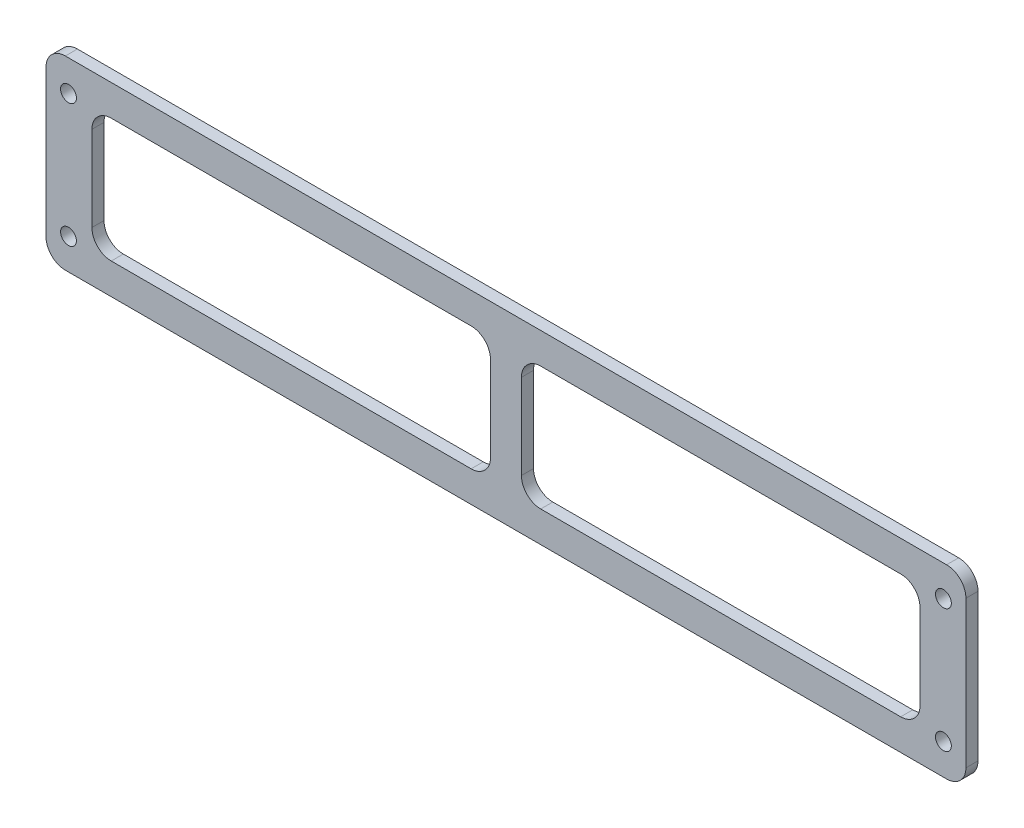
ISO-10303-21;
HEADER;
FILE_DESCRIPTION(('STEP AP214'),'2;1');
FILE_NAME('part.step','',(''),(''),'','','');
FILE_SCHEMA(('AUTOMOTIVE_DESIGN { 1 0 10303 214 1 1 1 1 }'));
ENDSEC;
DATA;
#1=APPLICATION_CONTEXT('core data for automotive mechanical design processes');
#2=APPLICATION_PROTOCOL_DEFINITION('international standard','automotive_design',2000,#1);
#3=PRODUCT_CONTEXT('',#1,'mechanical');
#4=PRODUCT('Part','Part','',(#3));
#5=PRODUCT_RELATED_PRODUCT_CATEGORY('part','',(#4));
#6=PRODUCT_DEFINITION_FORMATION('','',#4);
#7=PRODUCT_DEFINITION_CONTEXT('part definition',#1,'design');
#8=PRODUCT_DEFINITION('design','',#6,#7);
#9=PRODUCT_DEFINITION_SHAPE('','',#8);
#10=(LENGTH_UNIT() NAMED_UNIT(*) SI_UNIT(.MILLI.,.METRE.));
#11=(NAMED_UNIT(*) PLANE_ANGLE_UNIT() SI_UNIT($,.RADIAN.));
#12=(NAMED_UNIT(*) SI_UNIT($,.STERADIAN.) SOLID_ANGLE_UNIT());
#13=UNCERTAINTY_MEASURE_WITH_UNIT(LENGTH_MEASURE(1.E-05),#10,'distance_accuracy_value','');
#14=(GEOMETRIC_REPRESENTATION_CONTEXT(3) GLOBAL_UNCERTAINTY_ASSIGNED_CONTEXT((#13)) GLOBAL_UNIT_ASSIGNED_CONTEXT((#10,
#11,#12)) REPRESENTATION_CONTEXT('',''));
#15=CARTESIAN_POINT('',(0.,0.,0.));
#16=DIRECTION('',(0.,0.,1.));
#17=DIRECTION('',(1.,0.,0.));
#18=AXIS2_PLACEMENT_3D('',#15,#16,#17);
#19=CARTESIAN_POINT('',(0.,0.,3.125));
#20=DIRECTION('',(0.,0.,1.));
#21=DIRECTION('',(1.,0.,0.));
#22=AXIS2_PLACEMENT_3D('',#19,#20,#21);
#23=PLANE('',#22);
#24=CARTESIAN_POINT('',(113.175,16.,3.125));
#25=DIRECTION('',(0.,0.,1.));
#26=DIRECTION('',(1.,0.,0.));
#27=AXIS2_PLACEMENT_3D('',#24,#25,#26);
#28=CIRCLE('',#27,2.04999999999999);
#29=CARTESIAN_POINT('',(115.225,16.,3.125));
#30=VERTEX_POINT('',#29);
#31=EDGE_CURVE('E389',#30,#30,#28,.T.);
#32=ORIENTED_EDGE('',*,*,#31,.F.);
#33=EDGE_LOOP('',(#32));
#34=FACE_BOUND('',#33,.T.);
#35=CARTESIAN_POINT('',(-113.175,16.,3.125));
#36=DIRECTION('',(0.,0.,1.));
#37=DIRECTION('',(1.,0.,0.));
#38=AXIS2_PLACEMENT_3D('',#35,#36,#37);
#39=CIRCLE('',#38,2.04999999999999);
#40=CARTESIAN_POINT('',(-111.125,16.,3.125));
#41=VERTEX_POINT('',#40);
#42=EDGE_CURVE('E401',#41,#41,#39,.T.);
#43=ORIENTED_EDGE('',*,*,#42,.F.);
#44=EDGE_LOOP('',(#43));
#45=FACE_BOUND('',#44,.T.);
#46=DIRECTION('',(0.,1.,0.));
#47=VECTOR('',#46,1.);
#48=CARTESIAN_POINT('',(119.,-24.,3.125));
#49=LINE('',#48,#47);
#50=CARTESIAN_POINT('',(119.,-19.,3.125));
#51=VERTEX_POINT('',#50);
#52=CARTESIAN_POINT('',(119.,19.,3.125));
#53=VERTEX_POINT('',#52);
#54=EDGE_CURVE('E227',#51,#53,#49,.T.);
#55=ORIENTED_EDGE('',*,*,#54,.T.);
#56=CARTESIAN_POINT('',(114.,19.,3.125));
#57=DIRECTION('',(0.,0.,1.));
#58=DIRECTION('',(1.,0.,0.));
#59=AXIS2_PLACEMENT_3D('',#56,#57,#58);
#60=CIRCLE('',#59,5.);
#61=CARTESIAN_POINT('',(114.,24.,3.125));
#62=VERTEX_POINT('',#61);
#63=EDGE_CURVE('E289',#53,#62,#60,.T.);
#64=ORIENTED_EDGE('',*,*,#63,.T.);
#65=DIRECTION('',(-1.,0.,0.));
#66=VECTOR('',#65,1.);
#67=CARTESIAN_POINT('',(119.,24.,3.125));
#68=LINE('',#67,#66);
#69=CARTESIAN_POINT('',(-114.,24.,3.125));
#70=VERTEX_POINT('',#69);
#71=EDGE_CURVE('E222',#62,#70,#68,.T.);
#72=ORIENTED_EDGE('',*,*,#71,.T.);
#73=CARTESIAN_POINT('',(-114.,19.,3.125));
#74=DIRECTION('',(0.,0.,1.));
#75=DIRECTION('',(1.,0.,0.));
#76=AXIS2_PLACEMENT_3D('',#73,#74,#75);
#77=CIRCLE('',#76,5.);
#78=CARTESIAN_POINT('',(-119.,19.,3.125));
#79=VERTEX_POINT('',#78);
#80=EDGE_CURVE('E284',#70,#79,#77,.T.);
#81=ORIENTED_EDGE('',*,*,#80,.T.);
#82=DIRECTION('',(0.,-1.,0.));
#83=VECTOR('',#82,1.);
#84=CARTESIAN_POINT('',(-119.,-24.,3.125));
#85=LINE('',#84,#83);
#86=CARTESIAN_POINT('',(-119.,-19.,3.125));
#87=VERTEX_POINT('',#86);
#88=EDGE_CURVE('E407',#79,#87,#85,.T.);
#89=ORIENTED_EDGE('',*,*,#88,.T.);
#90=CARTESIAN_POINT('',(-114.,-19.,3.125));
#91=DIRECTION('',(0.,0.,1.));
#92=DIRECTION('',(1.,0.,0.));
#93=AXIS2_PLACEMENT_3D('',#90,#91,#92);
#94=CIRCLE('',#93,5.);
#95=CARTESIAN_POINT('',(-114.,-24.,3.125));
#96=VERTEX_POINT('',#95);
#97=EDGE_CURVE('E55',#87,#96,#94,.T.);
#98=ORIENTED_EDGE('',*,*,#97,.T.);
#99=DIRECTION('',(1.,0.,0.));
#100=VECTOR('',#99,1.);
#101=CARTESIAN_POINT('',(119.,-24.,3.125));
#102=LINE('',#101,#100);
#103=CARTESIAN_POINT('',(114.,-24.,3.125));
#104=VERTEX_POINT('',#103);
#105=EDGE_CURVE('E409',#96,#104,#102,.T.);
#106=ORIENTED_EDGE('',*,*,#105,.T.);
#107=CARTESIAN_POINT('',(114.,-19.,3.125));
#108=DIRECTION('',(0.,0.,1.));
#109=DIRECTION('',(1.,0.,0.));
#110=AXIS2_PLACEMENT_3D('',#107,#108,#109);
#111=CIRCLE('',#110,5.);
#112=EDGE_CURVE('E287',#104,#51,#111,.T.);
#113=ORIENTED_EDGE('',*,*,#112,.T.);
#114=EDGE_LOOP('',(#55,#64,#72,#81,#89,#98,#106,#113));
#115=FACE_BOUND('',#114,.T.);
#116=CARTESIAN_POINT('',(-113.175,-16.,3.125));
#117=DIRECTION('',(0.,0.,1.));
#118=DIRECTION('',(1.,0.,0.));
#119=AXIS2_PLACEMENT_3D('',#116,#117,#118);
#120=CIRCLE('',#119,2.04999999999999);
#121=CARTESIAN_POINT('',(-111.125,-16.,3.125));
#122=VERTEX_POINT('',#121);
#123=EDGE_CURVE('E395',#122,#122,#120,.T.);
#124=ORIENTED_EDGE('',*,*,#123,.F.);
#125=EDGE_LOOP('',(#124));
#126=FACE_BOUND('',#125,.T.);
#127=CARTESIAN_POINT('',(113.175,-16.,3.125));
#128=DIRECTION('',(0.,0.,1.));
#129=DIRECTION('',(1.,0.,0.));
#130=AXIS2_PLACEMENT_3D('',#127,#128,#129);
#131=CIRCLE('',#130,2.04999999999999);
#132=CARTESIAN_POINT('',(115.225,-16.,3.125));
#133=VERTEX_POINT('',#132);
#134=EDGE_CURVE('E383',#133,#133,#131,.T.);
#135=ORIENTED_EDGE('',*,*,#134,.F.);
#136=EDGE_LOOP('',(#135));
#137=FACE_BOUND('',#136,.T.);
#138=DIRECTION('',(1.,0.,0.));
#139=VECTOR('',#138,1.);
#140=CARTESIAN_POINT('',(-107.125,-16.,3.125));
#141=LINE('',#140,#139);
#142=CARTESIAN_POINT('',(-102.125,-16.,3.125));
#143=VERTEX_POINT('',#142);
#144=CARTESIAN_POINT('',(-9.00000000000001,-16.,3.125));
#145=VERTEX_POINT('',#144);
#146=EDGE_CURVE('E367',#143,#145,#141,.T.);
#147=ORIENTED_EDGE('',*,*,#146,.F.);
#148=CARTESIAN_POINT('',(-102.125,-11.,3.125));
#149=DIRECTION('',(0.,0.,1.));
#150=DIRECTION('',(1.,0.,0.));
#151=AXIS2_PLACEMENT_3D('',#148,#149,#150);
#152=CIRCLE('',#151,5.);
#153=CARTESIAN_POINT('',(-107.125,-11.,3.125));
#154=VERTEX_POINT('',#153);
#155=EDGE_CURVE('E207',#143,#154,#152,.F.);
#156=ORIENTED_EDGE('',*,*,#155,.T.);
#157=DIRECTION('',(0.,-1.,0.));
#158=VECTOR('',#157,1.);
#159=CARTESIAN_POINT('',(-107.125,16.,3.125));
#160=LINE('',#159,#158);
#161=CARTESIAN_POINT('',(-107.125,11.,3.125));
#162=VERTEX_POINT('',#161);
#163=EDGE_CURVE('E365',#162,#154,#160,.T.);
#164=ORIENTED_EDGE('',*,*,#163,.F.);
#165=CARTESIAN_POINT('',(-102.125,11.,3.125));
#166=DIRECTION('',(0.,0.,1.));
#167=DIRECTION('',(1.,0.,0.));
#168=AXIS2_PLACEMENT_3D('',#165,#166,#167);
#169=CIRCLE('',#168,5.);
#170=CARTESIAN_POINT('',(-102.125,16.,3.125));
#171=VERTEX_POINT('',#170);
#172=EDGE_CURVE('E206',#162,#171,#169,.F.);
#173=ORIENTED_EDGE('',*,*,#172,.T.);
#174=DIRECTION('',(-1.,0.,0.));
#175=VECTOR('',#174,1.);
#176=CARTESIAN_POINT('',(-107.125,16.,3.125));
#177=LINE('',#176,#175);
#178=CARTESIAN_POINT('',(-9.00000000000001,16.,3.125));
#179=VERTEX_POINT('',#178);
#180=EDGE_CURVE('E373',#179,#171,#177,.T.);
#181=ORIENTED_EDGE('',*,*,#180,.F.);
#182=CARTESIAN_POINT('',(-9.00000000000001,11.,3.125));
#183=DIRECTION('',(0.,0.,1.));
#184=DIRECTION('',(1.,0.,0.));
#185=AXIS2_PLACEMENT_3D('',#182,#183,#184);
#186=CIRCLE('',#185,5.);
#187=CARTESIAN_POINT('',(-4.,11.,3.125));
#188=VERTEX_POINT('',#187);
#189=EDGE_CURVE('E306',#179,#188,#186,.F.);
#190=ORIENTED_EDGE('',*,*,#189,.T.);
#191=DIRECTION('',(0.,1.,0.));
#192=VECTOR('',#191,1.);
#193=CARTESIAN_POINT('',(-4.,16.,3.125));
#194=LINE('',#193,#192);
#195=CARTESIAN_POINT('',(-4.,-11.,3.125));
#196=VERTEX_POINT('',#195);
#197=EDGE_CURVE('E370',#196,#188,#194,.T.);
#198=ORIENTED_EDGE('',*,*,#197,.F.);
#199=CARTESIAN_POINT('',(-9.00000000000001,-11.,3.125));
#200=DIRECTION('',(0.,0.,1.));
#201=DIRECTION('',(1.,0.,0.));
#202=AXIS2_PLACEMENT_3D('',#199,#200,#201);
#203=CIRCLE('',#202,5.);
#204=EDGE_CURVE('E310',#196,#145,#203,.F.);
#205=ORIENTED_EDGE('',*,*,#204,.T.);
#206=EDGE_LOOP('',(#147,#156,#164,#173,#181,#190,#198,#205));
#207=FACE_BOUND('',#206,.T.);
#208=DIRECTION('',(-1.,0.,0.));
#209=VECTOR('',#208,1.);
#210=CARTESIAN_POINT('',(107.125,16.,3.125));
#211=LINE('',#210,#209);
#212=CARTESIAN_POINT('',(102.125,16.,3.125));
#213=VERTEX_POINT('',#212);
#214=CARTESIAN_POINT('',(9.00000000000012,16.,3.125));
#215=VERTEX_POINT('',#214);
#216=EDGE_CURVE('E351',#213,#215,#211,.T.);
#217=ORIENTED_EDGE('',*,*,#216,.F.);
#218=CARTESIAN_POINT('',(102.125,11.,3.125));
#219=DIRECTION('',(0.,0.,1.));
#220=DIRECTION('',(1.,0.,0.));
#221=AXIS2_PLACEMENT_3D('',#218,#219,#220);
#222=CIRCLE('',#221,5.);
#223=CARTESIAN_POINT('',(107.125,11.,3.125));
#224=VERTEX_POINT('',#223);
#225=EDGE_CURVE('E318',#213,#224,#222,.F.);
#226=ORIENTED_EDGE('',*,*,#225,.T.);
#227=DIRECTION('',(0.,1.,0.));
#228=VECTOR('',#227,1.);
#229=CARTESIAN_POINT('',(107.125,16.,3.125));
#230=LINE('',#229,#228);
#231=CARTESIAN_POINT('',(107.125,-11.,3.125));
#232=VERTEX_POINT('',#231);
#233=EDGE_CURVE('E338',#232,#224,#230,.T.);
#234=ORIENTED_EDGE('',*,*,#233,.F.);
#235=CARTESIAN_POINT('',(102.125,-11.,3.125));
#236=DIRECTION('',(0.,0.,1.));
#237=DIRECTION('',(1.,0.,0.));
#238=AXIS2_PLACEMENT_3D('',#235,#236,#237);
#239=CIRCLE('',#238,5.);
#240=CARTESIAN_POINT('',(102.125,-16.,3.125));
#241=VERTEX_POINT('',#240);
#242=EDGE_CURVE('E314',#232,#241,#239,.F.);
#243=ORIENTED_EDGE('',*,*,#242,.T.);
#244=DIRECTION('',(1.,0.,0.));
#245=VECTOR('',#244,1.);
#246=CARTESIAN_POINT('',(107.125,-16.,3.125));
#247=LINE('',#246,#245);
#248=CARTESIAN_POINT('',(9.00000000000012,-16.,3.125));
#249=VERTEX_POINT('',#248);
#250=EDGE_CURVE('E218',#249,#241,#247,.T.);
#251=ORIENTED_EDGE('',*,*,#250,.F.);
#252=CARTESIAN_POINT('',(9.00000000000012,-11.,3.125));
#253=DIRECTION('',(0.,0.,1.));
#254=DIRECTION('',(1.,0.,0.));
#255=AXIS2_PLACEMENT_3D('',#252,#253,#254);
#256=CIRCLE('',#255,5.);
#257=CARTESIAN_POINT('',(4.00000000000011,-11.,3.125));
#258=VERTEX_POINT('',#257);
#259=EDGE_CURVE('E11',#249,#258,#256,.F.);
#260=ORIENTED_EDGE('',*,*,#259,.T.);
#261=DIRECTION('',(0.,-1.,0.));
#262=VECTOR('',#261,1.);
#263=CARTESIAN_POINT('',(4.00000000000011,16.,3.125));
#264=LINE('',#263,#262);
#265=CARTESIAN_POINT('',(4.00000000000011,11.,3.125));
#266=VERTEX_POINT('',#265);
#267=EDGE_CURVE('E346',#266,#258,#264,.T.);
#268=ORIENTED_EDGE('',*,*,#267,.F.);
#269=CARTESIAN_POINT('',(9.00000000000012,11.,3.125));
#270=DIRECTION('',(0.,0.,1.));
#271=DIRECTION('',(1.,0.,0.));
#272=AXIS2_PLACEMENT_3D('',#269,#270,#271);
#273=CIRCLE('',#272,5.);
#274=EDGE_CURVE('E322',#266,#215,#273,.F.);
#275=ORIENTED_EDGE('',*,*,#274,.T.);
#276=EDGE_LOOP('',(#217,#226,#234,#243,#251,#260,#268,#275));
#277=FACE_BOUND('',#276,.T.);
#278=ADVANCED_FACE('F33',(#34,#45,#115,#126,#137,#207,#277),#23,.T.);
#279=CARTESIAN_POINT('',(0.,0.,0.));
#280=DIRECTION('',(0.,0.,1.));
#281=DIRECTION('',(1.,0.,0.));
#282=AXIS2_PLACEMENT_3D('',#279,#280,#281);
#283=PLANE('',#282);
#284=DIRECTION('',(-1.,0.,0.));
#285=VECTOR('',#284,1.);
#286=CARTESIAN_POINT('',(-107.125,16.,0.));
#287=LINE('',#286,#285);
#288=CARTESIAN_POINT('',(-9.00000000000001,16.,0.));
#289=VERTEX_POINT('',#288);
#290=CARTESIAN_POINT('',(-102.125,16.,0.));
#291=VERTEX_POINT('',#290);
#292=EDGE_CURVE('E201',#289,#291,#287,.T.);
#293=ORIENTED_EDGE('',*,*,#292,.T.);
#294=CARTESIAN_POINT('',(-102.125,11.,0.));
#295=DIRECTION('',(0.,0.,1.));
#296=DIRECTION('',(1.,0.,0.));
#297=AXIS2_PLACEMENT_3D('',#294,#295,#296);
#298=CIRCLE('',#297,5.);
#299=CARTESIAN_POINT('',(-107.125,11.,0.));
#300=VERTEX_POINT('',#299);
#301=EDGE_CURVE('E195',#291,#300,#298,.T.);
#302=ORIENTED_EDGE('',*,*,#301,.T.);
#303=DIRECTION('',(0.,-1.,0.));
#304=VECTOR('',#303,1.);
#305=CARTESIAN_POINT('',(-107.125,16.,0.));
#306=LINE('',#305,#304);
#307=CARTESIAN_POINT('',(-107.125,-11.,0.));
#308=VERTEX_POINT('',#307);
#309=EDGE_CURVE('E199',#300,#308,#306,.T.);
#310=ORIENTED_EDGE('',*,*,#309,.T.);
#311=CARTESIAN_POINT('',(-102.125,-11.,0.));
#312=DIRECTION('',(0.,0.,1.));
#313=DIRECTION('',(1.,0.,0.));
#314=AXIS2_PLACEMENT_3D('',#311,#312,#313);
#315=CIRCLE('',#314,5.);
#316=CARTESIAN_POINT('',(-102.125,-16.,0.));
#317=VERTEX_POINT('',#316);
#318=EDGE_CURVE('E300',#308,#317,#315,.T.);
#319=ORIENTED_EDGE('',*,*,#318,.T.);
#320=DIRECTION('',(1.,0.,0.));
#321=VECTOR('',#320,1.);
#322=CARTESIAN_POINT('',(-107.125,-16.,0.));
#323=LINE('',#322,#321);
#324=CARTESIAN_POINT('',(-9.00000000000001,-16.,0.));
#325=VERTEX_POINT('',#324);
#326=EDGE_CURVE('E217',#317,#325,#323,.T.);
#327=ORIENTED_EDGE('',*,*,#326,.T.);
#328=CARTESIAN_POINT('',(-9.00000000000001,-11.,0.));
#329=DIRECTION('',(0.,0.,1.));
#330=DIRECTION('',(1.,0.,0.));
#331=AXIS2_PLACEMENT_3D('',#328,#329,#330);
#332=CIRCLE('',#331,5.);
#333=CARTESIAN_POINT('',(-4.,-11.,0.));
#334=VERTEX_POINT('',#333);
#335=EDGE_CURVE('E308',#325,#334,#332,.T.);
#336=ORIENTED_EDGE('',*,*,#335,.T.);
#337=DIRECTION('',(0.,1.,0.));
#338=VECTOR('',#337,1.);
#339=CARTESIAN_POINT('',(-4.,16.,0.));
#340=LINE('',#339,#338);
#341=CARTESIAN_POINT('',(-4.,11.,0.));
#342=VERTEX_POINT('',#341);
#343=EDGE_CURVE('E379',#334,#342,#340,.T.);
#344=ORIENTED_EDGE('',*,*,#343,.T.);
#345=CARTESIAN_POINT('',(-9.00000000000001,11.,0.));
#346=DIRECTION('',(0.,0.,1.));
#347=DIRECTION('',(1.,0.,0.));
#348=AXIS2_PLACEMENT_3D('',#345,#346,#347);
#349=CIRCLE('',#348,5.);
#350=EDGE_CURVE('E304',#342,#289,#349,.T.);
#351=ORIENTED_EDGE('',*,*,#350,.T.);
#352=EDGE_LOOP('',(#293,#302,#310,#319,#327,#336,#344,#351));
#353=FACE_BOUND('',#352,.T.);
#354=DIRECTION('',(-1.,0.,0.));
#355=VECTOR('',#354,1.);
#356=CARTESIAN_POINT('',(119.,24.,0.));
#357=LINE('',#356,#355);
#358=CARTESIAN_POINT('',(114.,24.,0.));
#359=VERTEX_POINT('',#358);
#360=CARTESIAN_POINT('',(-114.,24.,0.));
#361=VERTEX_POINT('',#360);
#362=EDGE_CURVE('E230',#359,#361,#357,.T.);
#363=ORIENTED_EDGE('',*,*,#362,.F.);
#364=CARTESIAN_POINT('',(114.,19.,0.));
#365=DIRECTION('',(0.,0.,1.));
#366=DIRECTION('',(1.,0.,0.));
#367=AXIS2_PLACEMENT_3D('',#364,#365,#366);
#368=CIRCLE('',#367,5.);
#369=CARTESIAN_POINT('',(119.,19.,0.));
#370=VERTEX_POINT('',#369);
#371=EDGE_CURVE('E277',#359,#370,#368,.F.);
#372=ORIENTED_EDGE('',*,*,#371,.T.);
#373=DIRECTION('',(0.,1.,0.));
#374=VECTOR('',#373,1.);
#375=CARTESIAN_POINT('',(119.,-24.,0.));
#376=LINE('',#375,#374);
#377=CARTESIAN_POINT('',(119.,-19.,0.));
#378=VERTEX_POINT('',#377);
#379=EDGE_CURVE('E416',#378,#370,#376,.T.);
#380=ORIENTED_EDGE('',*,*,#379,.F.);
#381=CARTESIAN_POINT('',(114.,-19.,0.));
#382=DIRECTION('',(0.,0.,1.));
#383=DIRECTION('',(1.,0.,0.));
#384=AXIS2_PLACEMENT_3D('',#381,#382,#383);
#385=CIRCLE('',#384,5.);
#386=CARTESIAN_POINT('',(114.,-24.,0.));
#387=VERTEX_POINT('',#386);
#388=EDGE_CURVE('E275',#378,#387,#385,.F.);
#389=ORIENTED_EDGE('',*,*,#388,.T.);
#390=DIRECTION('',(1.,0.,0.));
#391=VECTOR('',#390,1.);
#392=CARTESIAN_POINT('',(119.,-24.,0.));
#393=LINE('',#392,#391);
#394=CARTESIAN_POINT('',(-114.,-24.,0.));
#395=VERTEX_POINT('',#394);
#396=EDGE_CURVE('E415',#395,#387,#393,.T.);
#397=ORIENTED_EDGE('',*,*,#396,.F.);
#398=CARTESIAN_POINT('',(-114.,-19.,0.));
#399=DIRECTION('',(0.,0.,1.));
#400=DIRECTION('',(1.,0.,0.));
#401=AXIS2_PLACEMENT_3D('',#398,#399,#400);
#402=CIRCLE('',#401,5.);
#403=CARTESIAN_POINT('',(-119.,-19.,0.));
#404=VERTEX_POINT('',#403);
#405=EDGE_CURVE('E273',#395,#404,#402,.F.);
#406=ORIENTED_EDGE('',*,*,#405,.T.);
#407=DIRECTION('',(0.,-1.,0.));
#408=VECTOR('',#407,1.);
#409=CARTESIAN_POINT('',(-119.,-24.,0.));
#410=LINE('',#409,#408);
#411=CARTESIAN_POINT('',(-119.,19.,0.));
#412=VERTEX_POINT('',#411);
#413=EDGE_CURVE('E404',#412,#404,#410,.T.);
#414=ORIENTED_EDGE('',*,*,#413,.F.);
#415=CARTESIAN_POINT('',(-114.,19.,0.));
#416=DIRECTION('',(0.,0.,1.));
#417=DIRECTION('',(1.,0.,0.));
#418=AXIS2_PLACEMENT_3D('',#415,#416,#417);
#419=CIRCLE('',#418,5.);
#420=EDGE_CURVE('E271',#412,#361,#419,.F.);
#421=ORIENTED_EDGE('',*,*,#420,.T.);
#422=EDGE_LOOP('',(#363,#372,#380,#389,#397,#406,#414,#421));
#423=FACE_BOUND('',#422,.T.);
#424=CARTESIAN_POINT('',(-113.175,16.,0.));
#425=DIRECTION('',(0.,0.,1.));
#426=DIRECTION('',(1.,0.,0.));
#427=AXIS2_PLACEMENT_3D('',#424,#425,#426);
#428=CIRCLE('',#427,2.04999999999999);
#429=CARTESIAN_POINT('',(-111.125,16.,0.));
#430=VERTEX_POINT('',#429);
#431=EDGE_CURVE('E398',#430,#430,#428,.T.);
#432=ORIENTED_EDGE('',*,*,#431,.T.);
#433=EDGE_LOOP('',(#432));
#434=FACE_BOUND('',#433,.T.);
#435=CARTESIAN_POINT('',(-113.175,-16.,0.));
#436=DIRECTION('',(0.,0.,1.));
#437=DIRECTION('',(1.,0.,0.));
#438=AXIS2_PLACEMENT_3D('',#435,#436,#437);
#439=CIRCLE('',#438,2.04999999999999);
#440=CARTESIAN_POINT('',(-111.125,-16.,0.));
#441=VERTEX_POINT('',#440);
#442=EDGE_CURVE('E392',#441,#441,#439,.T.);
#443=ORIENTED_EDGE('',*,*,#442,.T.);
#444=EDGE_LOOP('',(#443));
#445=FACE_BOUND('',#444,.T.);
#446=CARTESIAN_POINT('',(113.175,16.,0.));
#447=DIRECTION('',(0.,0.,1.));
#448=DIRECTION('',(1.,0.,0.));
#449=AXIS2_PLACEMENT_3D('',#446,#447,#448);
#450=CIRCLE('',#449,2.04999999999999);
#451=CARTESIAN_POINT('',(115.225,16.,0.));
#452=VERTEX_POINT('',#451);
#453=EDGE_CURVE('E386',#452,#452,#450,.T.);
#454=ORIENTED_EDGE('',*,*,#453,.T.);
#455=EDGE_LOOP('',(#454));
#456=FACE_BOUND('',#455,.T.);
#457=CARTESIAN_POINT('',(113.175,-16.,0.));
#458=DIRECTION('',(0.,0.,1.));
#459=DIRECTION('',(1.,0.,0.));
#460=AXIS2_PLACEMENT_3D('',#457,#458,#459);
#461=CIRCLE('',#460,2.04999999999999);
#462=CARTESIAN_POINT('',(115.225,-16.,0.));
#463=VERTEX_POINT('',#462);
#464=EDGE_CURVE('E375',#463,#463,#461,.T.);
#465=ORIENTED_EDGE('',*,*,#464,.T.);
#466=EDGE_LOOP('',(#465));
#467=FACE_BOUND('',#466,.T.);
#468=DIRECTION('',(1.,0.,0.));
#469=VECTOR('',#468,1.);
#470=CARTESIAN_POINT('',(107.125,-16.,0.));
#471=LINE('',#470,#469);
#472=CARTESIAN_POINT('',(9.00000000000012,-16.,0.));
#473=VERTEX_POINT('',#472);
#474=CARTESIAN_POINT('',(102.125,-16.,0.));
#475=VERTEX_POINT('',#474);
#476=EDGE_CURVE('E327',#473,#475,#471,.T.);
#477=ORIENTED_EDGE('',*,*,#476,.T.);
#478=CARTESIAN_POINT('',(102.125,-11.,0.));
#479=DIRECTION('',(0.,0.,1.));
#480=DIRECTION('',(1.,0.,0.));
#481=AXIS2_PLACEMENT_3D('',#478,#479,#480);
#482=CIRCLE('',#481,5.);
#483=CARTESIAN_POINT('',(107.125,-11.,0.));
#484=VERTEX_POINT('',#483);
#485=EDGE_CURVE('E312',#475,#484,#482,.T.);
#486=ORIENTED_EDGE('',*,*,#485,.T.);
#487=DIRECTION('',(0.,1.,0.));
#488=VECTOR('',#487,1.);
#489=CARTESIAN_POINT('',(107.125,16.,0.));
#490=LINE('',#489,#488);
#491=CARTESIAN_POINT('',(107.125,11.,0.));
#492=VERTEX_POINT('',#491);
#493=EDGE_CURVE('E358',#484,#492,#490,.T.);
#494=ORIENTED_EDGE('',*,*,#493,.T.);
#495=CARTESIAN_POINT('',(102.125,11.,0.));
#496=DIRECTION('',(0.,0.,1.));
#497=DIRECTION('',(1.,0.,0.));
#498=AXIS2_PLACEMENT_3D('',#495,#496,#497);
#499=CIRCLE('',#498,5.);
#500=CARTESIAN_POINT('',(102.125,16.,0.));
#501=VERTEX_POINT('',#500);
#502=EDGE_CURVE('E316',#492,#501,#499,.T.);
#503=ORIENTED_EDGE('',*,*,#502,.T.);
#504=DIRECTION('',(-1.,0.,0.));
#505=VECTOR('',#504,1.);
#506=CARTESIAN_POINT('',(107.125,16.,0.));
#507=LINE('',#506,#505);
#508=CARTESIAN_POINT('',(9.00000000000012,16.,0.));
#509=VERTEX_POINT('',#508);
#510=EDGE_CURVE('E361',#501,#509,#507,.T.);
#511=ORIENTED_EDGE('',*,*,#510,.T.);
#512=CARTESIAN_POINT('',(9.00000000000012,11.,0.));
#513=DIRECTION('',(0.,0.,1.));
#514=DIRECTION('',(1.,0.,0.));
#515=AXIS2_PLACEMENT_3D('',#512,#513,#514);
#516=CIRCLE('',#515,5.);
#517=CARTESIAN_POINT('',(4.00000000000011,11.,0.));
#518=VERTEX_POINT('',#517);
#519=EDGE_CURVE('E320',#509,#518,#516,.T.);
#520=ORIENTED_EDGE('',*,*,#519,.T.);
#521=DIRECTION('',(0.,-1.,0.));
#522=VECTOR('',#521,1.);
#523=CARTESIAN_POINT('',(4.00000000000011,16.,0.));
#524=LINE('',#523,#522);
#525=CARTESIAN_POINT('',(4.00000000000011,-11.,0.));
#526=VERTEX_POINT('',#525);
#527=EDGE_CURVE('E329',#518,#526,#524,.T.);
#528=ORIENTED_EDGE('',*,*,#527,.T.);
#529=CARTESIAN_POINT('',(9.00000000000012,-11.,0.));
#530=DIRECTION('',(0.,0.,1.));
#531=DIRECTION('',(1.,0.,0.));
#532=AXIS2_PLACEMENT_3D('',#529,#530,#531);
#533=CIRCLE('',#532,5.);
#534=EDGE_CURVE('E41',#526,#473,#533,.T.);
#535=ORIENTED_EDGE('',*,*,#534,.T.);
#536=EDGE_LOOP('',(#477,#486,#494,#503,#511,#520,#528,#535));
#537=FACE_BOUND('',#536,.T.);
#538=ADVANCED_FACE('F197',(#353,#423,#434,#445,#456,#467,#537),#283,.F.);
#539=CARTESIAN_POINT('',(-119.,-24.,3.125));
#540=DIRECTION('',(1.,0.,0.));
#541=DIRECTION('',(0.,0.,-1.));
#542=AXIS2_PLACEMENT_3D('',#539,#540,#541);
#543=PLANE('',#542);
#544=ORIENTED_EDGE('',*,*,#413,.T.);
#545=DIRECTION('',(0.,0.,-1.));
#546=VECTOR('',#545,1.);
#547=CARTESIAN_POINT('',(-119.,-19.,3.125));
#548=LINE('',#547,#546);
#549=EDGE_CURVE('E298',#404,#87,#548,.F.);
#550=ORIENTED_EDGE('',*,*,#549,.T.);
#551=ORIENTED_EDGE('',*,*,#88,.F.);
#552=DIRECTION('',(0.,0.,-1.));
#553=VECTOR('',#552,1.);
#554=CARTESIAN_POINT('',(-119.,19.,3.125));
#555=LINE('',#554,#553);
#556=EDGE_CURVE('E295',#79,#412,#555,.T.);
#557=ORIENTED_EDGE('',*,*,#556,.T.);
#558=EDGE_LOOP('',(#544,#550,#551,#557));
#559=FACE_BOUND('',#558,.T.);
#560=ADVANCED_FACE('F434',(#559),#543,.F.);
#561=CARTESIAN_POINT('',(119.,-24.,3.125));
#562=DIRECTION('',(0.,1.,0.));
#563=DIRECTION('',(-1.,0.,0.));
#564=AXIS2_PLACEMENT_3D('',#561,#562,#563);
#565=PLANE('',#564);
#566=ORIENTED_EDGE('',*,*,#396,.T.);
#567=DIRECTION('',(0.,0.,-1.));
#568=VECTOR('',#567,1.);
#569=CARTESIAN_POINT('',(114.,-24.,3.125));
#570=LINE('',#569,#568);
#571=EDGE_CURVE('E48',#387,#104,#570,.F.);
#572=ORIENTED_EDGE('',*,*,#571,.T.);
#573=ORIENTED_EDGE('',*,*,#105,.F.);
#574=DIRECTION('',(0.,0.,-1.));
#575=VECTOR('',#574,1.);
#576=CARTESIAN_POINT('',(-114.,-24.,3.125));
#577=LINE('',#576,#575);
#578=EDGE_CURVE('E291',#96,#395,#577,.T.);
#579=ORIENTED_EDGE('',*,*,#578,.T.);
#580=EDGE_LOOP('',(#566,#572,#573,#579));
#581=FACE_BOUND('',#580,.T.);
#582=ADVANCED_FACE('F441',(#581),#565,.F.);
#583=CARTESIAN_POINT('',(119.,-24.,3.125));
#584=DIRECTION('',(-1.,0.,0.));
#585=DIRECTION('',(0.,0.,1.));
#586=AXIS2_PLACEMENT_3D('',#583,#584,#585);
#587=PLANE('',#586);
#588=ORIENTED_EDGE('',*,*,#379,.T.);
#589=DIRECTION('',(0.,0.,-1.));
#590=VECTOR('',#589,1.);
#591=CARTESIAN_POINT('',(119.,19.,3.125));
#592=LINE('',#591,#590);
#593=EDGE_CURVE('E282',#370,#53,#592,.F.);
#594=ORIENTED_EDGE('',*,*,#593,.T.);
#595=ORIENTED_EDGE('',*,*,#54,.F.);
#596=DIRECTION('',(0.,0.,-1.));
#597=VECTOR('',#596,1.);
#598=CARTESIAN_POINT('',(119.,-19.,3.125));
#599=LINE('',#598,#597);
#600=EDGE_CURVE('E279',#51,#378,#599,.T.);
#601=ORIENTED_EDGE('',*,*,#600,.T.);
#602=EDGE_LOOP('',(#588,#594,#595,#601));
#603=FACE_BOUND('',#602,.T.);
#604=ADVANCED_FACE('F448',(#603),#587,.F.);
#605=CARTESIAN_POINT('',(119.,24.,3.125));
#606=DIRECTION('',(0.,-1.,0.));
#607=DIRECTION('',(1.,0.,0.));
#608=AXIS2_PLACEMENT_3D('',#605,#606,#607);
#609=PLANE('',#608);
#610=ORIENTED_EDGE('',*,*,#71,.F.);
#611=DIRECTION('',(0.,0.,-1.));
#612=VECTOR('',#611,1.);
#613=CARTESIAN_POINT('',(114.,24.,3.125));
#614=LINE('',#613,#612);
#615=EDGE_CURVE('E268',#62,#359,#614,.T.);
#616=ORIENTED_EDGE('',*,*,#615,.T.);
#617=ORIENTED_EDGE('',*,*,#362,.T.);
#618=DIRECTION('',(0.,0.,-1.));
#619=VECTOR('',#618,1.);
#620=CARTESIAN_POINT('',(-114.,24.,3.125));
#621=LINE('',#620,#619);
#622=EDGE_CURVE('E266',#361,#70,#621,.F.);
#623=ORIENTED_EDGE('',*,*,#622,.T.);
#624=EDGE_LOOP('',(#610,#616,#617,#623));
#625=FACE_BOUND('',#624,.T.);
#626=ADVANCED_FACE('F426',(#625),#609,.F.);
#627=CARTESIAN_POINT('',(-113.175,16.,3.125));
#628=DIRECTION('',(0.,0.,-1.));
#629=DIRECTION('',(-1.,0.,0.));
#630=AXIS2_PLACEMENT_3D('',#627,#628,#629);
#631=CYLINDRICAL_SURFACE('',#630,2.04999999999999);
#632=ORIENTED_EDGE('',*,*,#42,.T.);
#633=EDGE_LOOP('',(#632));
#634=FACE_BOUND('',#633,.T.);
#635=ORIENTED_EDGE('',*,*,#431,.F.);
#636=EDGE_LOOP('',(#635));
#637=FACE_BOUND('',#636,.T.);
#638=ADVANCED_FACE('F471',(#634,#637),#631,.F.);
#639=CARTESIAN_POINT('',(-113.175,-16.,3.125));
#640=DIRECTION('',(0.,0.,-1.));
#641=DIRECTION('',(-1.,0.,0.));
#642=AXIS2_PLACEMENT_3D('',#639,#640,#641);
#643=CYLINDRICAL_SURFACE('',#642,2.04999999999999);
#644=ORIENTED_EDGE('',*,*,#123,.T.);
#645=EDGE_LOOP('',(#644));
#646=FACE_BOUND('',#645,.T.);
#647=ORIENTED_EDGE('',*,*,#442,.F.);
#648=EDGE_LOOP('',(#647));
#649=FACE_BOUND('',#648,.T.);
#650=ADVANCED_FACE('F550',(#646,#649),#643,.F.);
#651=CARTESIAN_POINT('',(113.175,16.,3.125));
#652=DIRECTION('',(0.,0.,-1.));
#653=DIRECTION('',(-1.,0.,0.));
#654=AXIS2_PLACEMENT_3D('',#651,#652,#653);
#655=CYLINDRICAL_SURFACE('',#654,2.04999999999999);
#656=ORIENTED_EDGE('',*,*,#31,.T.);
#657=EDGE_LOOP('',(#656));
#658=FACE_BOUND('',#657,.T.);
#659=ORIENTED_EDGE('',*,*,#453,.F.);
#660=EDGE_LOOP('',(#659));
#661=FACE_BOUND('',#660,.T.);
#662=ADVANCED_FACE('F547',(#658,#661),#655,.F.);
#663=CARTESIAN_POINT('',(113.175,-16.,3.125));
#664=DIRECTION('',(0.,0.,-1.));
#665=DIRECTION('',(-1.,0.,0.));
#666=AXIS2_PLACEMENT_3D('',#663,#664,#665);
#667=CYLINDRICAL_SURFACE('',#666,2.04999999999999);
#668=ORIENTED_EDGE('',*,*,#134,.T.);
#669=EDGE_LOOP('',(#668));
#670=FACE_BOUND('',#669,.T.);
#671=ORIENTED_EDGE('',*,*,#464,.F.);
#672=EDGE_LOOP('',(#671));
#673=FACE_BOUND('',#672,.T.);
#674=ADVANCED_FACE('F544',(#670,#673),#667,.F.);
#675=CARTESIAN_POINT('',(-107.125,16.,3.125));
#676=DIRECTION('',(1.,0.,0.));
#677=DIRECTION('',(0.,0.,-1.));
#678=AXIS2_PLACEMENT_3D('',#675,#676,#677);
#679=PLANE('',#678);
#680=ORIENTED_EDGE('',*,*,#163,.T.);
#681=DIRECTION('',(0.,0.,-1.));
#682=VECTOR('',#681,1.);
#683=CARTESIAN_POINT('',(-107.125,-11.,0.));
#684=LINE('',#683,#682);
#685=EDGE_CURVE('E216',#154,#308,#684,.T.);
#686=ORIENTED_EDGE('',*,*,#685,.T.);
#687=ORIENTED_EDGE('',*,*,#309,.F.);
#688=DIRECTION('',(0.,0.,-1.));
#689=VECTOR('',#688,1.);
#690=CARTESIAN_POINT('',(-107.125,11.,3.125));
#691=LINE('',#690,#689);
#692=EDGE_CURVE('E213',#300,#162,#691,.F.);
#693=ORIENTED_EDGE('',*,*,#692,.T.);
#694=EDGE_LOOP('',(#680,#686,#687,#693));
#695=FACE_BOUND('',#694,.T.);
#696=ADVANCED_FACE('F212',(#695),#679,.T.);
#697=CARTESIAN_POINT('',(-107.125,-16.,3.125));
#698=DIRECTION('',(0.,1.,0.));
#699=DIRECTION('',(-1.,0.,0.));
#700=AXIS2_PLACEMENT_3D('',#697,#698,#699);
#701=PLANE('',#700);
#702=ORIENTED_EDGE('',*,*,#326,.F.);
#703=DIRECTION('',(0.,0.,-1.));
#704=VECTOR('',#703,1.);
#705=CARTESIAN_POINT('',(-102.125,-16.,3.125));
#706=LINE('',#705,#704);
#707=EDGE_CURVE('E235',#317,#143,#706,.F.);
#708=ORIENTED_EDGE('',*,*,#707,.T.);
#709=ORIENTED_EDGE('',*,*,#146,.T.);
#710=DIRECTION('',(0.,0.,-1.));
#711=VECTOR('',#710,1.);
#712=CARTESIAN_POINT('',(-9.00000000000001,-16.,0.));
#713=LINE('',#712,#711);
#714=EDGE_CURVE('E224',#145,#325,#713,.T.);
#715=ORIENTED_EDGE('',*,*,#714,.T.);
#716=EDGE_LOOP('',(#702,#708,#709,#715));
#717=FACE_BOUND('',#716,.T.);
#718=ADVANCED_FACE('F537',(#717),#701,.T.);
#719=CARTESIAN_POINT('',(-4.,16.,3.125));
#720=DIRECTION('',(-1.,0.,0.));
#721=DIRECTION('',(0.,0.,1.));
#722=AXIS2_PLACEMENT_3D('',#719,#720,#721);
#723=PLANE('',#722);
#724=ORIENTED_EDGE('',*,*,#197,.T.);
#725=DIRECTION('',(0.,0.,-1.));
#726=VECTOR('',#725,1.);
#727=CARTESIAN_POINT('',(-4.,11.,0.));
#728=LINE('',#727,#726);
#729=EDGE_CURVE('E243',#188,#342,#728,.T.);
#730=ORIENTED_EDGE('',*,*,#729,.T.);
#731=ORIENTED_EDGE('',*,*,#343,.F.);
#732=DIRECTION('',(0.,0.,-1.));
#733=VECTOR('',#732,1.);
#734=CARTESIAN_POINT('',(-4.,-11.,3.125));
#735=LINE('',#734,#733);
#736=EDGE_CURVE('E241',#334,#196,#735,.F.);
#737=ORIENTED_EDGE('',*,*,#736,.T.);
#738=EDGE_LOOP('',(#724,#730,#731,#737));
#739=FACE_BOUND('',#738,.T.);
#740=ADVANCED_FACE('F530',(#739),#723,.T.);
#741=CARTESIAN_POINT('',(-107.125,16.,3.125));
#742=DIRECTION('',(0.,-1.,0.));
#743=DIRECTION('',(0.,0.,-1.));
#744=AXIS2_PLACEMENT_3D('',#741,#742,#743);
#745=PLANE('',#744);
#746=ORIENTED_EDGE('',*,*,#180,.T.);
#747=DIRECTION('',(0.,0.,-1.));
#748=VECTOR('',#747,1.);
#749=CARTESIAN_POINT('',(-102.125,16.,0.));
#750=LINE('',#749,#748);
#751=EDGE_CURVE('E239',#171,#291,#750,.T.);
#752=ORIENTED_EDGE('',*,*,#751,.T.);
#753=ORIENTED_EDGE('',*,*,#292,.F.);
#754=DIRECTION('',(0.,0.,-1.));
#755=VECTOR('',#754,1.);
#756=CARTESIAN_POINT('',(-9.00000000000001,16.,3.125));
#757=LINE('',#756,#755);
#758=EDGE_CURVE('E237',#289,#179,#757,.F.);
#759=ORIENTED_EDGE('',*,*,#758,.T.);
#760=EDGE_LOOP('',(#746,#752,#753,#759));
#761=FACE_BOUND('',#760,.T.);
#762=ADVANCED_FACE('F523',(#761),#745,.T.);
#763=CARTESIAN_POINT('',(107.125,16.,3.125));
#764=DIRECTION('',(-1.,0.,0.));
#765=DIRECTION('',(0.,0.,1.));
#766=AXIS2_PLACEMENT_3D('',#763,#764,#765);
#767=PLANE('',#766);
#768=ORIENTED_EDGE('',*,*,#493,.F.);
#769=DIRECTION('',(0.,0.,-1.));
#770=VECTOR('',#769,1.);
#771=CARTESIAN_POINT('',(107.125,-11.,3.125));
#772=LINE('',#771,#770);
#773=EDGE_CURVE('E254',#484,#232,#772,.F.);
#774=ORIENTED_EDGE('',*,*,#773,.T.);
#775=ORIENTED_EDGE('',*,*,#233,.T.);
#776=DIRECTION('',(0.,0.,-1.));
#777=VECTOR('',#776,1.);
#778=CARTESIAN_POINT('',(107.125,11.,0.));
#779=LINE('',#778,#777);
#780=EDGE_CURVE('E251',#224,#492,#779,.T.);
#781=ORIENTED_EDGE('',*,*,#780,.T.);
#782=EDGE_LOOP('',(#768,#774,#775,#781));
#783=FACE_BOUND('',#782,.T.);
#784=ADVANCED_FACE('F520',(#783),#767,.T.);
#785=CARTESIAN_POINT('',(107.125,16.,3.125));
#786=DIRECTION('',(0.,-1.,0.));
#787=DIRECTION('',(0.,0.,-1.));
#788=AXIS2_PLACEMENT_3D('',#785,#786,#787);
#789=PLANE('',#788);
#790=ORIENTED_EDGE('',*,*,#510,.F.);
#791=DIRECTION('',(0.,0.,-1.));
#792=VECTOR('',#791,1.);
#793=CARTESIAN_POINT('',(102.125,16.,3.125));
#794=LINE('',#793,#792);
#795=EDGE_CURVE('E259',#501,#213,#794,.F.);
#796=ORIENTED_EDGE('',*,*,#795,.T.);
#797=ORIENTED_EDGE('',*,*,#216,.T.);
#798=DIRECTION('',(0.,0.,-1.));
#799=VECTOR('',#798,1.);
#800=CARTESIAN_POINT('',(9.00000000000012,16.,0.));
#801=LINE('',#800,#799);
#802=EDGE_CURVE('E256',#215,#509,#801,.T.);
#803=ORIENTED_EDGE('',*,*,#802,.T.);
#804=EDGE_LOOP('',(#790,#796,#797,#803));
#805=FACE_BOUND('',#804,.T.);
#806=ADVANCED_FACE('F512',(#805),#789,.T.);
#807=CARTESIAN_POINT('',(4.00000000000011,16.,3.125));
#808=DIRECTION('',(1.,0.,0.));
#809=DIRECTION('',(0.,0.,-1.));
#810=AXIS2_PLACEMENT_3D('',#807,#808,#809);
#811=PLANE('',#810);
#812=ORIENTED_EDGE('',*,*,#527,.F.);
#813=DIRECTION('',(0.,0.,-1.));
#814=VECTOR('',#813,1.);
#815=CARTESIAN_POINT('',(4.00000000000011,11.,3.125));
#816=LINE('',#815,#814);
#817=EDGE_CURVE('E264',#518,#266,#816,.F.);
#818=ORIENTED_EDGE('',*,*,#817,.T.);
#819=ORIENTED_EDGE('',*,*,#267,.T.);
#820=DIRECTION('',(0.,0.,-1.));
#821=VECTOR('',#820,1.);
#822=CARTESIAN_POINT('',(4.00000000000011,-11.,0.));
#823=LINE('',#822,#821);
#824=EDGE_CURVE('E261',#258,#526,#823,.T.);
#825=ORIENTED_EDGE('',*,*,#824,.T.);
#826=EDGE_LOOP('',(#812,#818,#819,#825));
#827=FACE_BOUND('',#826,.T.);
#828=ADVANCED_FACE('F349',(#827),#811,.T.);
#829=CARTESIAN_POINT('',(107.125,-16.,3.125));
#830=DIRECTION('',(0.,1.,0.));
#831=DIRECTION('',(-1.,0.,0.));
#832=AXIS2_PLACEMENT_3D('',#829,#830,#831);
#833=PLANE('',#832);
#834=ORIENTED_EDGE('',*,*,#250,.T.);
#835=DIRECTION('',(0.,0.,-1.));
#836=VECTOR('',#835,1.);
#837=CARTESIAN_POINT('',(102.125,-16.,0.));
#838=LINE('',#837,#836);
#839=EDGE_CURVE('E248',#241,#475,#838,.T.);
#840=ORIENTED_EDGE('',*,*,#839,.T.);
#841=ORIENTED_EDGE('',*,*,#476,.F.);
#842=DIRECTION('',(0.,0.,-1.));
#843=VECTOR('',#842,1.);
#844=CARTESIAN_POINT('',(9.00000000000012,-16.,3.125));
#845=LINE('',#844,#843);
#846=EDGE_CURVE('E246',#473,#249,#845,.F.);
#847=ORIENTED_EDGE('',*,*,#846,.T.);
#848=EDGE_LOOP('',(#834,#840,#841,#847));
#849=FACE_BOUND('',#848,.T.);
#850=ADVANCED_FACE('F335',(#849),#833,.T.);
#851=CARTESIAN_POINT('',(-102.125,-11.,3.125));
#852=DIRECTION('',(0.,0.,1.));
#853=DIRECTION('',(1.,0.,0.));
#854=AXIS2_PLACEMENT_3D('',#851,#852,#853);
#855=CYLINDRICAL_SURFACE('',#854,5.);
#856=ORIENTED_EDGE('',*,*,#155,.F.);
#857=ORIENTED_EDGE('',*,*,#707,.F.);
#858=ORIENTED_EDGE('',*,*,#318,.F.);
#859=ORIENTED_EDGE('',*,*,#685,.F.);
#860=EDGE_LOOP('',(#856,#857,#858,#859));
#861=FACE_BOUND('',#860,.T.);
#862=ADVANCED_FACE('F482',(#861),#855,.F.);
#863=CARTESIAN_POINT('',(-102.125,11.,3.125));
#864=DIRECTION('',(0.,0.,1.));
#865=DIRECTION('',(1.,0.,0.));
#866=AXIS2_PLACEMENT_3D('',#863,#864,#865);
#867=CYLINDRICAL_SURFACE('',#866,5.);
#868=ORIENTED_EDGE('',*,*,#172,.F.);
#869=ORIENTED_EDGE('',*,*,#692,.F.);
#870=ORIENTED_EDGE('',*,*,#301,.F.);
#871=ORIENTED_EDGE('',*,*,#751,.F.);
#872=EDGE_LOOP('',(#868,#869,#870,#871));
#873=FACE_BOUND('',#872,.T.);
#874=ADVANCED_FACE('F221',(#873),#867,.F.);
#875=CARTESIAN_POINT('',(-9.00000000000001,11.,3.125));
#876=DIRECTION('',(0.,0.,1.));
#877=DIRECTION('',(1.,0.,0.));
#878=AXIS2_PLACEMENT_3D('',#875,#876,#877);
#879=CYLINDRICAL_SURFACE('',#878,5.);
#880=ORIENTED_EDGE('',*,*,#189,.F.);
#881=ORIENTED_EDGE('',*,*,#758,.F.);
#882=ORIENTED_EDGE('',*,*,#350,.F.);
#883=ORIENTED_EDGE('',*,*,#729,.F.);
#884=EDGE_LOOP('',(#880,#881,#882,#883));
#885=FACE_BOUND('',#884,.T.);
#886=ADVANCED_FACE('F488',(#885),#879,.F.);
#887=CARTESIAN_POINT('',(-9.00000000000001,-11.,3.125));
#888=DIRECTION('',(0.,0.,1.));
#889=DIRECTION('',(1.,0.,0.));
#890=AXIS2_PLACEMENT_3D('',#887,#888,#889);
#891=CYLINDRICAL_SURFACE('',#890,5.);
#892=ORIENTED_EDGE('',*,*,#204,.F.);
#893=ORIENTED_EDGE('',*,*,#736,.F.);
#894=ORIENTED_EDGE('',*,*,#335,.F.);
#895=ORIENTED_EDGE('',*,*,#714,.F.);
#896=EDGE_LOOP('',(#892,#893,#894,#895));
#897=FACE_BOUND('',#896,.T.);
#898=ADVANCED_FACE('F491',(#897),#891,.F.);
#899=CARTESIAN_POINT('',(102.125,-11.,3.125));
#900=DIRECTION('',(0.,0.,1.));
#901=DIRECTION('',(1.,0.,0.));
#902=AXIS2_PLACEMENT_3D('',#899,#900,#901);
#903=CYLINDRICAL_SURFACE('',#902,5.);
#904=ORIENTED_EDGE('',*,*,#242,.F.);
#905=ORIENTED_EDGE('',*,*,#773,.F.);
#906=ORIENTED_EDGE('',*,*,#485,.F.);
#907=ORIENTED_EDGE('',*,*,#839,.F.);
#908=EDGE_LOOP('',(#904,#905,#906,#907));
#909=FACE_BOUND('',#908,.T.);
#910=ADVANCED_FACE('F495',(#909),#903,.F.);
#911=CARTESIAN_POINT('',(102.125,11.,3.125));
#912=DIRECTION('',(0.,0.,1.));
#913=DIRECTION('',(1.,0.,0.));
#914=AXIS2_PLACEMENT_3D('',#911,#912,#913);
#915=CYLINDRICAL_SURFACE('',#914,5.);
#916=ORIENTED_EDGE('',*,*,#225,.F.);
#917=ORIENTED_EDGE('',*,*,#795,.F.);
#918=ORIENTED_EDGE('',*,*,#502,.F.);
#919=ORIENTED_EDGE('',*,*,#780,.F.);
#920=EDGE_LOOP('',(#916,#917,#918,#919));
#921=FACE_BOUND('',#920,.T.);
#922=ADVANCED_FACE('F499',(#921),#915,.F.);
#923=CARTESIAN_POINT('',(9.00000000000012,11.,3.125));
#924=DIRECTION('',(0.,0.,1.));
#925=DIRECTION('',(1.,0.,0.));
#926=AXIS2_PLACEMENT_3D('',#923,#924,#925);
#927=CYLINDRICAL_SURFACE('',#926,5.);
#928=ORIENTED_EDGE('',*,*,#274,.F.);
#929=ORIENTED_EDGE('',*,*,#817,.F.);
#930=ORIENTED_EDGE('',*,*,#519,.F.);
#931=ORIENTED_EDGE('',*,*,#802,.F.);
#932=EDGE_LOOP('',(#928,#929,#930,#931));
#933=FACE_BOUND('',#932,.T.);
#934=ADVANCED_FACE('F459',(#933),#927,.F.);
#935=CARTESIAN_POINT('',(9.00000000000012,-11.,3.125));
#936=DIRECTION('',(0.,0.,1.));
#937=DIRECTION('',(1.,0.,0.));
#938=AXIS2_PLACEMENT_3D('',#935,#936,#937);
#939=CYLINDRICAL_SURFACE('',#938,5.);
#940=ORIENTED_EDGE('',*,*,#259,.F.);
#941=ORIENTED_EDGE('',*,*,#846,.F.);
#942=ORIENTED_EDGE('',*,*,#534,.F.);
#943=ORIENTED_EDGE('',*,*,#824,.F.);
#944=EDGE_LOOP('',(#940,#941,#942,#943));
#945=FACE_BOUND('',#944,.T.);
#946=ADVANCED_FACE('F341',(#945),#939,.F.);
#947=CARTESIAN_POINT('',(114.,19.,3.125));
#948=DIRECTION('',(0.,0.,-1.));
#949=DIRECTION('',(-1.,0.,0.));
#950=AXIS2_PLACEMENT_3D('',#947,#948,#949);
#951=CYLINDRICAL_SURFACE('',#950,5.);
#952=ORIENTED_EDGE('',*,*,#63,.F.);
#953=ORIENTED_EDGE('',*,*,#593,.F.);
#954=ORIENTED_EDGE('',*,*,#371,.F.);
#955=ORIENTED_EDGE('',*,*,#615,.F.);
#956=EDGE_LOOP('',(#952,#953,#954,#955));
#957=FACE_BOUND('',#956,.T.);
#958=ADVANCED_FACE('F451',(#957),#951,.T.);
#959=CARTESIAN_POINT('',(114.,-19.,3.125));
#960=DIRECTION('',(0.,0.,-1.));
#961=DIRECTION('',(-1.,0.,0.));
#962=AXIS2_PLACEMENT_3D('',#959,#960,#961);
#963=CYLINDRICAL_SURFACE('',#962,5.);
#964=ORIENTED_EDGE('',*,*,#112,.F.);
#965=ORIENTED_EDGE('',*,*,#571,.F.);
#966=ORIENTED_EDGE('',*,*,#388,.F.);
#967=ORIENTED_EDGE('',*,*,#600,.F.);
#968=EDGE_LOOP('',(#964,#965,#966,#967));
#969=FACE_BOUND('',#968,.T.);
#970=ADVANCED_FACE('F446',(#969),#963,.T.);
#971=CARTESIAN_POINT('',(-114.,-19.,3.125));
#972=DIRECTION('',(0.,0.,-1.));
#973=DIRECTION('',(-1.,0.,0.));
#974=AXIS2_PLACEMENT_3D('',#971,#972,#973);
#975=CYLINDRICAL_SURFACE('',#974,5.);
#976=ORIENTED_EDGE('',*,*,#97,.F.);
#977=ORIENTED_EDGE('',*,*,#549,.F.);
#978=ORIENTED_EDGE('',*,*,#405,.F.);
#979=ORIENTED_EDGE('',*,*,#578,.F.);
#980=EDGE_LOOP('',(#976,#977,#978,#979));
#981=FACE_BOUND('',#980,.T.);
#982=ADVANCED_FACE('F438',(#981),#975,.T.);
#983=CARTESIAN_POINT('',(-114.,19.,3.125));
#984=DIRECTION('',(0.,0.,-1.));
#985=DIRECTION('',(-1.,0.,0.));
#986=AXIS2_PLACEMENT_3D('',#983,#984,#985);
#987=CYLINDRICAL_SURFACE('',#986,5.);
#988=ORIENTED_EDGE('',*,*,#80,.F.);
#989=ORIENTED_EDGE('',*,*,#622,.F.);
#990=ORIENTED_EDGE('',*,*,#420,.F.);
#991=ORIENTED_EDGE('',*,*,#556,.F.);
#992=EDGE_LOOP('',(#988,#989,#990,#991));
#993=FACE_BOUND('',#992,.T.);
#994=ADVANCED_FACE('F35',(#993),#987,.T.);
#995=CLOSED_SHELL('',(#278,#538,#560,#582,#604,#626,#638,#650,#662,#674,#696,#718,#740,#762,
#784,#806,#828,#850,#862,#874,#886,#898,#910,#922,#934,#946,#958,#970,#982,#994));
#996=MANIFOLD_SOLID_BREP('B2',#995);
#997=ADVANCED_BREP_SHAPE_REPRESENTATION('',(#18,#996),#14);
#998=SHAPE_DEFINITION_REPRESENTATION(#9,#997);
ENDSEC;
END-ISO-10303-21;
